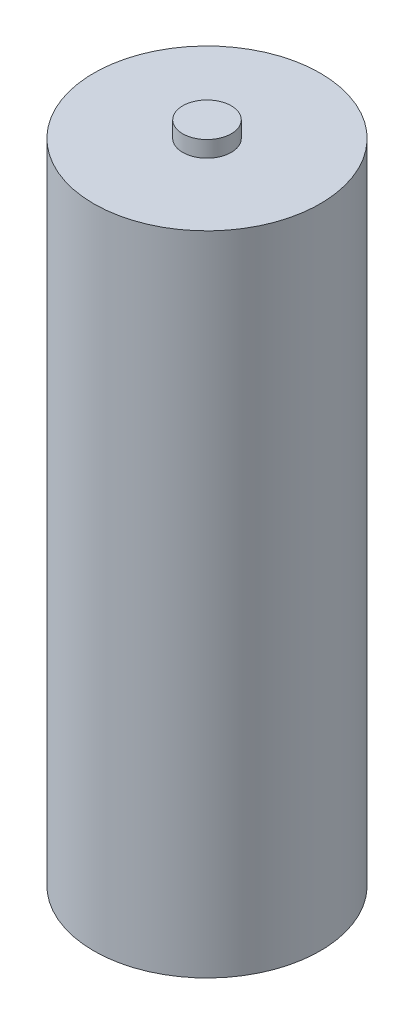
ISO-10303-21;
HEADER;
FILE_DESCRIPTION(('STEP AP214'),'2;1');
FILE_NAME('part.step','',(''),(''),'','','');
FILE_SCHEMA(('AUTOMOTIVE_DESIGN { 1 0 10303 214 1 1 1 1 }'));
ENDSEC;
DATA;
#1=APPLICATION_CONTEXT('core data for automotive mechanical design processes');
#2=APPLICATION_PROTOCOL_DEFINITION('international standard','automotive_design',2000,#1);
#3=PRODUCT_CONTEXT('',#1,'mechanical');
#4=PRODUCT('Part','Part','',(#3));
#5=PRODUCT_RELATED_PRODUCT_CATEGORY('part','',(#4));
#6=PRODUCT_DEFINITION_FORMATION('','',#4);
#7=PRODUCT_DEFINITION_CONTEXT('part definition',#1,'design');
#8=PRODUCT_DEFINITION('design','',#6,#7);
#9=PRODUCT_DEFINITION_SHAPE('','',#8);
#10=(LENGTH_UNIT() NAMED_UNIT(*) SI_UNIT(.MILLI.,.METRE.));
#11=(NAMED_UNIT(*) PLANE_ANGLE_UNIT() SI_UNIT($,.RADIAN.));
#12=(NAMED_UNIT(*) SI_UNIT($,.STERADIAN.) SOLID_ANGLE_UNIT());
#13=UNCERTAINTY_MEASURE_WITH_UNIT(LENGTH_MEASURE(1.E-05),#10,'distance_accuracy_value','');
#14=(GEOMETRIC_REPRESENTATION_CONTEXT(3) GLOBAL_UNCERTAINTY_ASSIGNED_CONTEXT((#13)) GLOBAL_UNIT_ASSIGNED_CONTEXT((#10,
#11,#12)) REPRESENTATION_CONTEXT('',''));
#15=CARTESIAN_POINT('',(0.,0.,0.));
#16=DIRECTION('',(0.,0.,1.));
#17=DIRECTION('',(1.,0.,0.));
#18=AXIS2_PLACEMENT_3D('',#15,#16,#17);
#19=CARTESIAN_POINT('',(0.,40.,0.));
#20=DIRECTION('',(0.,-1.,0.));
#21=DIRECTION('',(0.,0.,-1.));
#22=AXIS2_PLACEMENT_3D('',#19,#20,#21);
#23=CYLINDRICAL_SURFACE('',#22,7.);
#24=CARTESIAN_POINT('',(0.,40.,0.));
#25=DIRECTION('',(0.,1.,0.));
#26=DIRECTION('',(0.,0.,1.));
#27=AXIS2_PLACEMENT_3D('',#24,#25,#26);
#28=CIRCLE('',#27,7.);
#29=CARTESIAN_POINT('',(0.,40.,7.));
#30=VERTEX_POINT('',#29);
#31=EDGE_CURVE('E43',#30,#30,#28,.T.);
#32=ORIENTED_EDGE('',*,*,#31,.F.);
#33=EDGE_LOOP('',(#32));
#34=FACE_BOUND('',#33,.T.);
#35=CARTESIAN_POINT('',(0.,0.,0.));
#36=DIRECTION('',(0.,1.,0.));
#37=DIRECTION('',(0.,0.,1.));
#38=AXIS2_PLACEMENT_3D('',#35,#36,#37);
#39=CIRCLE('',#38,7.);
#40=CARTESIAN_POINT('',(0.,0.,7.));
#41=VERTEX_POINT('',#40);
#42=EDGE_CURVE('E39',#41,#41,#39,.T.);
#43=ORIENTED_EDGE('',*,*,#42,.T.);
#44=EDGE_LOOP('',(#43));
#45=FACE_BOUND('',#44,.T.);
#46=ADVANCED_FACE('F36',(#34,#45),#23,.T.);
#47=CARTESIAN_POINT('',(0.,40.,0.));
#48=DIRECTION('',(0.,1.,0.));
#49=DIRECTION('',(0.,0.,1.));
#50=AXIS2_PLACEMENT_3D('',#47,#48,#49);
#51=PLANE('',#50);
#52=CARTESIAN_POINT('',(0.,40.,0.));
#53=DIRECTION('',(0.,1.,0.));
#54=DIRECTION('',(0.,0.,1.));
#55=AXIS2_PLACEMENT_3D('',#52,#53,#54);
#56=CIRCLE('',#55,1.5);
#57=CARTESIAN_POINT('',(0.,40.,1.5));
#58=VERTEX_POINT('',#57);
#59=EDGE_CURVE('E10',#58,#58,#56,.T.);
#60=ORIENTED_EDGE('',*,*,#59,.F.);
#61=EDGE_LOOP('',(#60));
#62=FACE_BOUND('',#61,.T.);
#63=ORIENTED_EDGE('',*,*,#31,.T.);
#64=EDGE_LOOP('',(#63));
#65=FACE_BOUND('',#64,.T.);
#66=ADVANCED_FACE('F60',(#62,#65),#51,.T.);
#67=CARTESIAN_POINT('',(0.,0.,0.));
#68=DIRECTION('',(0.,1.,0.));
#69=DIRECTION('',(0.,0.,1.));
#70=AXIS2_PLACEMENT_3D('',#67,#68,#69);
#71=PLANE('',#70);
#72=ORIENTED_EDGE('',*,*,#42,.F.);
#73=EDGE_LOOP('',(#72));
#74=FACE_BOUND('',#73,.T.);
#75=ADVANCED_FACE('F57',(#74),#71,.F.);
#76=CARTESIAN_POINT('',(0.,41.,0.));
#77=DIRECTION('',(0.,-1.,0.));
#78=DIRECTION('',(0.,0.,-1.));
#79=AXIS2_PLACEMENT_3D('',#76,#77,#78);
#80=CYLINDRICAL_SURFACE('',#79,1.5);
#81=CARTESIAN_POINT('',(0.,41.,0.));
#82=DIRECTION('',(0.,1.,0.));
#83=DIRECTION('',(0.,0.,1.));
#84=AXIS2_PLACEMENT_3D('',#81,#82,#83);
#85=CIRCLE('',#84,1.5);
#86=CARTESIAN_POINT('',(0.,41.,1.5));
#87=VERTEX_POINT('',#86);
#88=EDGE_CURVE('E49',#87,#87,#85,.T.);
#89=ORIENTED_EDGE('',*,*,#88,.F.);
#90=EDGE_LOOP('',(#89));
#91=FACE_BOUND('',#90,.T.);
#92=ORIENTED_EDGE('',*,*,#59,.T.);
#93=EDGE_LOOP('',(#92));
#94=FACE_BOUND('',#93,.T.);
#95=ADVANCED_FACE('F59',(#91,#94),#80,.T.);
#96=CARTESIAN_POINT('',(0.,41.,0.));
#97=DIRECTION('',(0.,1.,0.));
#98=DIRECTION('',(0.,0.,1.));
#99=AXIS2_PLACEMENT_3D('',#96,#97,#98);
#100=PLANE('',#99);
#101=ORIENTED_EDGE('',*,*,#88,.T.);
#102=EDGE_LOOP('',(#101));
#103=FACE_BOUND('',#102,.T.);
#104=ADVANCED_FACE('F65',(#103),#100,.T.);
#105=CLOSED_SHELL('',(#46,#66,#75,#95,#104));
#106=MANIFOLD_SOLID_BREP('B2',#105);
#107=ADVANCED_BREP_SHAPE_REPRESENTATION('',(#18,#106),#14);
#108=SHAPE_DEFINITION_REPRESENTATION(#9,#107);
ENDSEC;
END-ISO-10303-21;
